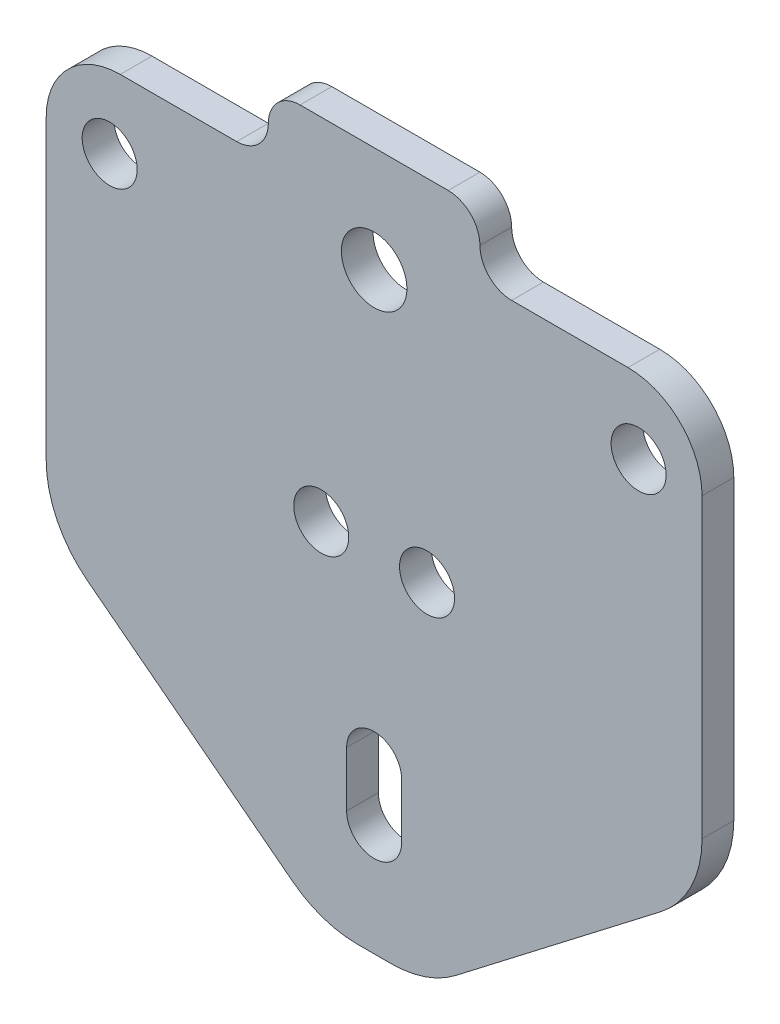
ISO-10303-21;
HEADER;
FILE_DESCRIPTION(('STEP AP214'),'2;1');
FILE_NAME('part.step','',(''),(''),'','','');
FILE_SCHEMA(('AUTOMOTIVE_DESIGN { 1 0 10303 214 1 1 1 1 }'));
ENDSEC;
DATA;
#1=APPLICATION_CONTEXT('core data for automotive mechanical design processes');
#2=APPLICATION_PROTOCOL_DEFINITION('international standard','automotive_design',2000,#1);
#3=PRODUCT_CONTEXT('',#1,'mechanical');
#4=PRODUCT('Part','Part','',(#3));
#5=PRODUCT_RELATED_PRODUCT_CATEGORY('part','',(#4));
#6=PRODUCT_DEFINITION_FORMATION('','',#4);
#7=PRODUCT_DEFINITION_CONTEXT('part definition',#1,'design');
#8=PRODUCT_DEFINITION('design','',#6,#7);
#9=PRODUCT_DEFINITION_SHAPE('','',#8);
#10=(LENGTH_UNIT() NAMED_UNIT(*) SI_UNIT(.MILLI.,.METRE.));
#11=(NAMED_UNIT(*) PLANE_ANGLE_UNIT() SI_UNIT($,.RADIAN.));
#12=(NAMED_UNIT(*) SI_UNIT($,.STERADIAN.) SOLID_ANGLE_UNIT());
#13=UNCERTAINTY_MEASURE_WITH_UNIT(LENGTH_MEASURE(1.E-05),#10,'distance_accuracy_value','');
#14=(GEOMETRIC_REPRESENTATION_CONTEXT(3) GLOBAL_UNCERTAINTY_ASSIGNED_CONTEXT((#13)) GLOBAL_UNIT_ASSIGNED_CONTEXT((#10,
#11,#12)) REPRESENTATION_CONTEXT('',''));
#15=CARTESIAN_POINT('',(0.,0.,0.));
#16=DIRECTION('',(0.,0.,1.));
#17=DIRECTION('',(1.,0.,0.));
#18=AXIS2_PLACEMENT_3D('',#15,#16,#17);
#19=CARTESIAN_POINT('',(10.,0.142069413619485,-3.));
#20=DIRECTION('',(0.,1.,0.));
#21=DIRECTION('',(-1.,0.,0.));
#22=AXIS2_PLACEMENT_3D('',#19,#20,#21);
#23=PLANE('',#22);
#24=DIRECTION('',(-1.,0.,0.));
#25=VECTOR('',#24,1.);
#26=CARTESIAN_POINT('',(10.,0.142069413619485,-3.));
#27=LINE('',#26,#25);
#28=CARTESIAN_POINT('',(7.,0.142069413619485,-3.));
#29=VERTEX_POINT('',#28);
#30=CARTESIAN_POINT('',(-7.,0.142069413619483,-3.));
#31=VERTEX_POINT('',#30);
#32=EDGE_CURVE('E265',#29,#31,#27,.T.);
#33=ORIENTED_EDGE('',*,*,#32,.T.);
#34=DIRECTION('',(0.,0.,1.));
#35=VECTOR('',#34,1.);
#36=CARTESIAN_POINT('',(-7.,0.142069413619483,-3.));
#37=LINE('',#36,#35);
#38=CARTESIAN_POINT('',(-7.,0.142069413619483,0.));
#39=VERTEX_POINT('',#38);
#40=EDGE_CURVE('E347',#31,#39,#37,.T.);
#41=ORIENTED_EDGE('',*,*,#40,.T.);
#42=DIRECTION('',(-1.,0.,0.));
#43=VECTOR('',#42,1.);
#44=CARTESIAN_POINT('',(10.,0.142069413619485,0.));
#45=LINE('',#44,#43);
#46=CARTESIAN_POINT('',(7.,0.142069413619485,0.));
#47=VERTEX_POINT('',#46);
#48=EDGE_CURVE('E249',#47,#39,#45,.T.);
#49=ORIENTED_EDGE('',*,*,#48,.F.);
#50=DIRECTION('',(0.,0.,1.));
#51=VECTOR('',#50,1.);
#52=CARTESIAN_POINT('',(7.,0.142069413619485,-3.));
#53=LINE('',#52,#51);
#54=EDGE_CURVE('E344',#47,#29,#53,.F.);
#55=ORIENTED_EDGE('',*,*,#54,.T.);
#56=EDGE_LOOP('',(#33,#41,#49,#55));
#57=FACE_BOUND('',#56,.T.);
#58=ADVANCED_FACE('F38',(#57),#23,.T.);
#59=CARTESIAN_POINT('',(10.,-5.85793058638052,-3.));
#60=DIRECTION('',(0.,1.,0.));
#61=DIRECTION('',(-1.,0.,0.));
#62=AXIS2_PLACEMENT_3D('',#59,#60,#61);
#63=PLANE('',#62);
#64=DIRECTION('',(-1.,0.,0.));
#65=VECTOR('',#64,1.);
#66=CARTESIAN_POINT('',(10.,-5.85793058638052,-3.));
#67=LINE('',#66,#65);
#68=CARTESIAN_POINT('',(24.,-5.85793058638051,-3.));
#69=VERTEX_POINT('',#68);
#70=CARTESIAN_POINT('',(13.,-5.85793058638052,-3.));
#71=VERTEX_POINT('',#70);
#72=EDGE_CURVE('E263',#69,#71,#67,.T.);
#73=ORIENTED_EDGE('',*,*,#72,.T.);
#74=DIRECTION('',(0.,0.,1.));
#75=VECTOR('',#74,1.);
#76=CARTESIAN_POINT('',(13.,-5.85793058638052,0.));
#77=LINE('',#76,#75);
#78=CARTESIAN_POINT('',(13.,-5.85793058638052,0.));
#79=VERTEX_POINT('',#78);
#80=EDGE_CURVE('E359',#71,#79,#77,.T.);
#81=ORIENTED_EDGE('',*,*,#80,.T.);
#82=DIRECTION('',(-1.,0.,0.));
#83=VECTOR('',#82,1.);
#84=CARTESIAN_POINT('',(10.,-5.85793058638052,0.));
#85=LINE('',#84,#83);
#86=CARTESIAN_POINT('',(24.,-5.85793058638051,0.));
#87=VERTEX_POINT('',#86);
#88=EDGE_CURVE('E284',#87,#79,#85,.T.);
#89=ORIENTED_EDGE('',*,*,#88,.F.);
#90=DIRECTION('',(0.,0.,1.));
#91=VECTOR('',#90,1.);
#92=CARTESIAN_POINT('',(24.,-5.85793058638051,-3.));
#93=LINE('',#92,#91);
#94=EDGE_CURVE('E342',#87,#69,#93,.F.);
#95=ORIENTED_EDGE('',*,*,#94,.T.);
#96=EDGE_LOOP('',(#73,#81,#89,#95));
#97=FACE_BOUND('',#96,.T.);
#98=ADVANCED_FACE('F385',(#97),#63,.T.);
#99=CARTESIAN_POINT('',(31.,-5.85793058638051,-3.));
#100=DIRECTION('',(1.,0.,0.));
#101=DIRECTION('',(0.,1.,0.));
#102=AXIS2_PLACEMENT_3D('',#99,#100,#101);
#103=PLANE('',#102);
#104=DIRECTION('',(0.,1.,0.));
#105=VECTOR('',#104,1.);
#106=CARTESIAN_POINT('',(31.,-5.85793058638051,-3.));
#107=LINE('',#106,#105);
#108=CARTESIAN_POINT('',(31.,-40.9339156118753,-3.));
#109=VERTEX_POINT('',#108);
#110=CARTESIAN_POINT('',(31.,-12.8579305863805,-3.));
#111=VERTEX_POINT('',#110);
#112=EDGE_CURVE('E260',#109,#111,#107,.T.);
#113=ORIENTED_EDGE('',*,*,#112,.T.);
#114=DIRECTION('',(0.,0.,1.));
#115=VECTOR('',#114,1.);
#116=CARTESIAN_POINT('',(31.,-12.8579305863805,-3.));
#117=LINE('',#116,#115);
#118=CARTESIAN_POINT('',(31.,-12.8579305863805,0.));
#119=VERTEX_POINT('',#118);
#120=EDGE_CURVE('E339',#111,#119,#117,.T.);
#121=ORIENTED_EDGE('',*,*,#120,.T.);
#122=DIRECTION('',(0.,1.,0.));
#123=VECTOR('',#122,1.);
#124=CARTESIAN_POINT('',(31.,-5.85793058638051,0.));
#125=LINE('',#124,#123);
#126=CARTESIAN_POINT('',(31.,-40.9339156118753,0.));
#127=VERTEX_POINT('',#126);
#128=EDGE_CURVE('E281',#127,#119,#125,.T.);
#129=ORIENTED_EDGE('',*,*,#128,.F.);
#130=DIRECTION('',(0.,0.,1.));
#131=VECTOR('',#130,1.);
#132=CARTESIAN_POINT('',(31.,-40.9339156118753,-3.));
#133=LINE('',#132,#131);
#134=EDGE_CURVE('E301',#127,#109,#133,.F.);
#135=ORIENTED_EDGE('',*,*,#134,.T.);
#136=EDGE_LOOP('',(#113,#121,#129,#135));
#137=FACE_BOUND('',#136,.T.);
#138=ADVANCED_FACE('F395',(#137),#103,.T.);
#139=CARTESIAN_POINT('',(31.,-45.8579305863805,-3.));
#140=DIRECTION('',(0.609710760849692,-0.7926239891046,0.));
#141=DIRECTION('',(0.7926239891046,0.609710760849692,0.));
#142=AXIS2_PLACEMENT_3D('',#139,#140,#141);
#143=PLANE('',#142);
#144=DIRECTION('',(0.7926239891046,0.609710760849692,0.));
#145=VECTOR('',#144,1.);
#146=CARTESIAN_POINT('',(31.,-45.8579305863805,-3.));
#147=LINE('',#146,#145);
#148=CARTESIAN_POINT('',(7.6958881416402,-63.7841704774265,-3.));
#149=VERTEX_POINT('',#148);
#150=CARTESIAN_POINT('',(27.0971076084969,-48.8601555029213,-3.));
#151=VERTEX_POINT('',#150);
#152=EDGE_CURVE('E257',#149,#151,#147,.T.);
#153=ORIENTED_EDGE('',*,*,#152,.T.);
#154=DIRECTION('',(0.,0.,1.));
#155=VECTOR('',#154,1.);
#156=CARTESIAN_POINT('',(27.0971076084969,-48.8601555029213,-3.));
#157=LINE('',#156,#155);
#158=CARTESIAN_POINT('',(27.0971076084969,-48.8601555029213,0.));
#159=VERTEX_POINT('',#158);
#160=EDGE_CURVE('E290',#151,#159,#157,.T.);
#161=ORIENTED_EDGE('',*,*,#160,.T.);
#162=DIRECTION('',(0.7926239891046,0.609710760849692,0.));
#163=VECTOR('',#162,1.);
#164=CARTESIAN_POINT('',(31.,-45.8579305863805,0.));
#165=LINE('',#164,#163);
#166=CARTESIAN_POINT('',(7.6958881416402,-63.7841704774265,0.));
#167=VERTEX_POINT('',#166);
#168=EDGE_CURVE('E278',#167,#159,#165,.T.);
#169=ORIENTED_EDGE('',*,*,#168,.F.);
#170=DIRECTION('',(0.,0.,1.));
#171=VECTOR('',#170,1.);
#172=CARTESIAN_POINT('',(7.6958881416402,-63.7841704774265,-3.));
#173=LINE('',#172,#171);
#174=EDGE_CURVE('E268',#167,#149,#173,.F.);
#175=ORIENTED_EDGE('',*,*,#174,.T.);
#176=EDGE_LOOP('',(#153,#161,#169,#175));
#177=FACE_BOUND('',#176,.T.);
#178=ADVANCED_FACE('F406',(#177),#143,.T.);
#179=CARTESIAN_POINT('',(5.,-65.8579305863805,-3.));
#180=DIRECTION('',(0.,-1.,0.));
#181=DIRECTION('',(0.,0.,-1.));
#182=AXIS2_PLACEMENT_3D('',#179,#180,#181);
#183=PLANE('',#182);
#184=DIRECTION('',(1.,0.,0.));
#185=VECTOR('',#184,1.);
#186=CARTESIAN_POINT('',(5.,-65.8579305863805,0.));
#187=LINE('',#186,#185);
#188=CARTESIAN_POINT('',(-1.59878053314328,-65.8579305863805,0.));
#189=VERTEX_POINT('',#188);
#190=CARTESIAN_POINT('',(1.59878053314328,-65.8579305863805,0.));
#191=VERTEX_POINT('',#190);
#192=EDGE_CURVE('E275',#189,#191,#187,.T.);
#193=ORIENTED_EDGE('',*,*,#192,.F.);
#194=DIRECTION('',(0.,0.,1.));
#195=VECTOR('',#194,1.);
#196=CARTESIAN_POINT('',(-1.59878053314328,-65.8579305863805,-3.));
#197=LINE('',#196,#195);
#198=CARTESIAN_POINT('',(-1.59878053314328,-65.8579305863805,-3.));
#199=VERTEX_POINT('',#198);
#200=EDGE_CURVE('E323',#189,#199,#197,.F.);
#201=ORIENTED_EDGE('',*,*,#200,.T.);
#202=DIRECTION('',(1.,0.,0.));
#203=VECTOR('',#202,1.);
#204=CARTESIAN_POINT('',(5.,-65.8579305863805,-3.));
#205=LINE('',#204,#203);
#206=CARTESIAN_POINT('',(1.59878053314328,-65.8579305863805,-3.));
#207=VERTEX_POINT('',#206);
#208=EDGE_CURVE('E254',#199,#207,#205,.T.);
#209=ORIENTED_EDGE('',*,*,#208,.T.);
#210=DIRECTION('',(0.,0.,1.));
#211=VECTOR('',#210,1.);
#212=CARTESIAN_POINT('',(1.59878053314328,-65.8579305863805,-3.));
#213=LINE('',#212,#211);
#214=EDGE_CURVE('E320',#207,#191,#213,.T.);
#215=ORIENTED_EDGE('',*,*,#214,.T.);
#216=EDGE_LOOP('',(#193,#201,#209,#215));
#217=FACE_BOUND('',#216,.T.);
#218=ADVANCED_FACE('F414',(#217),#183,.T.);
#219=CARTESIAN_POINT('',(-31.,-45.8579305863805,-3.));
#220=DIRECTION('',(-0.609710760849692,-0.7926239891046,0.));
#221=DIRECTION('',(0.792623989104601,-0.609710760849692,0.));
#222=AXIS2_PLACEMENT_3D('',#219,#220,#221);
#223=PLANE('',#222);
#224=DIRECTION('',(0.792623989104601,-0.609710760849692,0.));
#225=VECTOR('',#224,1.);
#226=CARTESIAN_POINT('',(-31.,-45.8579305863805,0.));
#227=LINE('',#226,#225);
#228=CARTESIAN_POINT('',(-27.0971076084969,-48.8601555029214,0.));
#229=VERTEX_POINT('',#228);
#230=CARTESIAN_POINT('',(-7.6958881416402,-63.7841704774265,0.));
#231=VERTEX_POINT('',#230);
#232=EDGE_CURVE('E272',#229,#231,#227,.T.);
#233=ORIENTED_EDGE('',*,*,#232,.F.);
#234=DIRECTION('',(0.,0.,1.));
#235=VECTOR('',#234,1.);
#236=CARTESIAN_POINT('',(-27.0971076084969,-48.8601555029214,-3.));
#237=LINE('',#236,#235);
#238=CARTESIAN_POINT('',(-27.0971076084969,-48.8601555029214,-3.));
#239=VERTEX_POINT('',#238);
#240=EDGE_CURVE('E318',#229,#239,#237,.F.);
#241=ORIENTED_EDGE('',*,*,#240,.T.);
#242=DIRECTION('',(0.792623989104601,-0.609710760849692,0.));
#243=VECTOR('',#242,1.);
#244=CARTESIAN_POINT('',(-31.,-45.8579305863805,-3.));
#245=LINE('',#244,#243);
#246=CARTESIAN_POINT('',(-7.6958881416402,-63.7841704774265,-3.));
#247=VERTEX_POINT('',#246);
#248=EDGE_CURVE('E251',#239,#247,#245,.T.);
#249=ORIENTED_EDGE('',*,*,#248,.T.);
#250=DIRECTION('',(0.,0.,1.));
#251=VECTOR('',#250,1.);
#252=CARTESIAN_POINT('',(-7.69588814164021,-63.7841704774265,-3.));
#253=LINE('',#252,#251);
#254=EDGE_CURVE('E315',#247,#231,#253,.T.);
#255=ORIENTED_EDGE('',*,*,#254,.T.);
#256=EDGE_LOOP('',(#233,#241,#249,#255));
#257=FACE_BOUND('',#256,.T.);
#258=ADVANCED_FACE('F424',(#257),#223,.T.);
#259=CARTESIAN_POINT('',(-31.,-45.8579305863805,-3.));
#260=DIRECTION('',(-1.,0.,0.));
#261=DIRECTION('',(0.,-1.,0.));
#262=AXIS2_PLACEMENT_3D('',#259,#260,#261);
#263=PLANE('',#262);
#264=DIRECTION('',(0.,-1.,0.));
#265=VECTOR('',#264,1.);
#266=CARTESIAN_POINT('',(-31.,-45.8579305863805,0.));
#267=LINE('',#266,#265);
#268=CARTESIAN_POINT('',(-31.,-12.8579305863805,0.));
#269=VERTEX_POINT('',#268);
#270=CARTESIAN_POINT('',(-31.,-40.9339156118754,0.));
#271=VERTEX_POINT('',#270);
#272=EDGE_CURVE('E270',#269,#271,#267,.T.);
#273=ORIENTED_EDGE('',*,*,#272,.F.);
#274=DIRECTION('',(0.,0.,1.));
#275=VECTOR('',#274,1.);
#276=CARTESIAN_POINT('',(-31.,-12.8579305863805,-3.));
#277=LINE('',#276,#275);
#278=CARTESIAN_POINT('',(-31.,-12.8579305863805,-3.));
#279=VERTEX_POINT('',#278);
#280=EDGE_CURVE('E332',#269,#279,#277,.F.);
#281=ORIENTED_EDGE('',*,*,#280,.T.);
#282=DIRECTION('',(0.,-1.,0.));
#283=VECTOR('',#282,1.);
#284=CARTESIAN_POINT('',(-31.,-45.8579305863805,-3.));
#285=LINE('',#284,#283);
#286=CARTESIAN_POINT('',(-31.,-40.9339156118754,-3.));
#287=VERTEX_POINT('',#286);
#288=EDGE_CURVE('E248',#279,#287,#285,.T.);
#289=ORIENTED_EDGE('',*,*,#288,.T.);
#290=DIRECTION('',(0.,0.,1.));
#291=VECTOR('',#290,1.);
#292=CARTESIAN_POINT('',(-31.,-40.9339156118754,-3.));
#293=LINE('',#292,#291);
#294=EDGE_CURVE('E312',#287,#271,#293,.T.);
#295=ORIENTED_EDGE('',*,*,#294,.T.);
#296=EDGE_LOOP('',(#273,#281,#289,#295));
#297=FACE_BOUND('',#296,.T.);
#298=ADVANCED_FACE('F433',(#297),#263,.T.);
#299=CARTESIAN_POINT('',(-31.,-5.85793058638051,-3.));
#300=DIRECTION('',(0.,1.,0.));
#301=DIRECTION('',(-1.,0.,0.));
#302=AXIS2_PLACEMENT_3D('',#299,#300,#301);
#303=PLANE('',#302);
#304=DIRECTION('',(-1.,0.,0.));
#305=VECTOR('',#304,1.);
#306=CARTESIAN_POINT('',(-31.,-5.85793058638051,0.));
#307=LINE('',#306,#305);
#308=CARTESIAN_POINT('',(-13.,-5.85793058638052,0.));
#309=VERTEX_POINT('',#308);
#310=CARTESIAN_POINT('',(-24.,-5.85793058638051,0.));
#311=VERTEX_POINT('',#310);
#312=EDGE_CURVE('E243',#309,#311,#307,.T.);
#313=ORIENTED_EDGE('',*,*,#312,.F.);
#314=DIRECTION('',(0.,0.,1.));
#315=VECTOR('',#314,1.);
#316=CARTESIAN_POINT('',(-13.,-5.85793058638052,-3.));
#317=LINE('',#316,#315);
#318=CARTESIAN_POINT('',(-13.,-5.85793058638052,-3.));
#319=VERTEX_POINT('',#318);
#320=EDGE_CURVE('E357',#309,#319,#317,.F.);
#321=ORIENTED_EDGE('',*,*,#320,.T.);
#322=DIRECTION('',(-1.,0.,0.));
#323=VECTOR('',#322,1.);
#324=CARTESIAN_POINT('',(-31.,-5.85793058638051,-3.));
#325=LINE('',#324,#323);
#326=CARTESIAN_POINT('',(-24.,-5.85793058638051,-3.));
#327=VERTEX_POINT('',#326);
#328=EDGE_CURVE('E246',#319,#327,#325,.T.);
#329=ORIENTED_EDGE('',*,*,#328,.T.);
#330=DIRECTION('',(0.,0.,1.));
#331=VECTOR('',#330,1.);
#332=CARTESIAN_POINT('',(-24.,-5.85793058638051,-3.));
#333=LINE('',#332,#331);
#334=EDGE_CURVE('E325',#327,#311,#333,.T.);
#335=ORIENTED_EDGE('',*,*,#334,.T.);
#336=EDGE_LOOP('',(#313,#321,#329,#335));
#337=FACE_BOUND('',#336,.T.);
#338=ADVANCED_FACE('F443',(#337),#303,.T.);
#339=CARTESIAN_POINT('',(0.,0.,-3.));
#340=DIRECTION('',(0.,0.,1.));
#341=DIRECTION('',(1.,0.,0.));
#342=AXIS2_PLACEMENT_3D('',#339,#340,#341);
#343=PLANE('',#342);
#344=CARTESIAN_POINT('',(-5.,-32.9579305863805,-3.));
#345=DIRECTION('',(0.,0.,1.));
#346=DIRECTION('',(1.,0.,0.));
#347=AXIS2_PLACEMENT_3D('',#344,#345,#346);
#348=CIRCLE('',#347,2.6);
#349=CARTESIAN_POINT('',(-2.4,-32.9579305863805,-3.));
#350=VERTEX_POINT('',#349);
#351=EDGE_CURVE('E372',#350,#350,#348,.T.);
#352=ORIENTED_EDGE('',*,*,#351,.T.);
#353=EDGE_LOOP('',(#352));
#354=FACE_BOUND('',#353,.T.);
#355=CARTESIAN_POINT('',(5.,-32.9579305863805,-3.));
#356=DIRECTION('',(0.,0.,1.));
#357=DIRECTION('',(1.,0.,0.));
#358=AXIS2_PLACEMENT_3D('',#355,#356,#357);
#359=CIRCLE('',#358,2.6);
#360=CARTESIAN_POINT('',(7.6,-32.9579305863805,-3.));
#361=VERTEX_POINT('',#360);
#362=EDGE_CURVE('E743',#361,#361,#359,.T.);
#363=ORIENTED_EDGE('',*,*,#362,.T.);
#364=EDGE_LOOP('',(#363));
#365=FACE_BOUND('',#364,.T.);
#366=CARTESIAN_POINT('',(0.,-9.85793058638052,-3.));
#367=DIRECTION('',(0.,0.,1.));
#368=DIRECTION('',(1.,0.,0.));
#369=AXIS2_PLACEMENT_3D('',#366,#367,#368);
#370=CIRCLE('',#369,3.1);
#371=CARTESIAN_POINT('',(3.1,-9.85793058638052,-3.));
#372=VERTEX_POINT('',#371);
#373=EDGE_CURVE('E224',#372,#372,#370,.T.);
#374=ORIENTED_EDGE('',*,*,#373,.T.);
#375=EDGE_LOOP('',(#374));
#376=FACE_BOUND('',#375,.T.);
#377=DIRECTION('',(0.,-1.,0.));
#378=VECTOR('',#377,1.);
#379=CARTESIAN_POINT('',(-2.59999999999999,-55.4579305863805,-3.));
#380=LINE('',#379,#378);
#381=CARTESIAN_POINT('',(-2.59999999999999,-50.2579305863805,-3.));
#382=VERTEX_POINT('',#381);
#383=CARTESIAN_POINT('',(-2.59999999999999,-55.4579305863805,-3.));
#384=VERTEX_POINT('',#383);
#385=EDGE_CURVE('E198',#382,#384,#380,.T.);
#386=ORIENTED_EDGE('',*,*,#385,.T.);
#387=CARTESIAN_POINT('',(0.,-55.4579305863805,-3.));
#388=DIRECTION('',(0.,0.,1.));
#389=DIRECTION('',(1.,0.,0.));
#390=AXIS2_PLACEMENT_3D('',#387,#388,#389);
#391=CIRCLE('',#390,2.59999999999999);
#392=CARTESIAN_POINT('',(2.59999999999999,-55.4579305863805,-3.));
#393=VERTEX_POINT('',#392);
#394=EDGE_CURVE('E190',#384,#393,#391,.T.);
#395=ORIENTED_EDGE('',*,*,#394,.T.);
#396=DIRECTION('',(0.,1.,0.));
#397=VECTOR('',#396,1.);
#398=CARTESIAN_POINT('',(2.59999999999999,-55.4579305863805,-3.));
#399=LINE('',#398,#397);
#400=CARTESIAN_POINT('',(2.59999999999999,-50.2579305863805,-3.));
#401=VERTEX_POINT('',#400);
#402=EDGE_CURVE('E202',#393,#401,#399,.T.);
#403=ORIENTED_EDGE('',*,*,#402,.T.);
#404=CARTESIAN_POINT('',(0.,-50.2579305863805,-3.));
#405=DIRECTION('',(0.,0.,1.));
#406=DIRECTION('',(1.,0.,0.));
#407=AXIS2_PLACEMENT_3D('',#404,#405,#406);
#408=CIRCLE('',#407,2.59999999999999);
#409=EDGE_CURVE('E206',#401,#382,#408,.T.);
#410=ORIENTED_EDGE('',*,*,#409,.T.);
#411=EDGE_LOOP('',(#386,#395,#403,#410));
#412=FACE_BOUND('',#411,.T.);
#413=CARTESIAN_POINT('',(25.,-12.8579305863805,-3.));
#414=DIRECTION('',(0.,0.,1.));
#415=DIRECTION('',(1.,0.,0.));
#416=AXIS2_PLACEMENT_3D('',#413,#414,#415);
#417=CIRCLE('',#416,2.6);
#418=CARTESIAN_POINT('',(27.6,-12.8579305863805,-3.));
#419=VERTEX_POINT('',#418);
#420=EDGE_CURVE('E234',#419,#419,#417,.T.);
#421=ORIENTED_EDGE('',*,*,#420,.T.);
#422=EDGE_LOOP('',(#421));
#423=FACE_BOUND('',#422,.T.);
#424=CARTESIAN_POINT('',(-25.,-12.8579305863805,-3.));
#425=DIRECTION('',(0.,0.,1.));
#426=DIRECTION('',(1.,0.,0.));
#427=AXIS2_PLACEMENT_3D('',#424,#425,#426);
#428=CIRCLE('',#427,2.6);
#429=CARTESIAN_POINT('',(-22.4,-12.8579305863805,-3.));
#430=VERTEX_POINT('',#429);
#431=EDGE_CURVE('E240',#430,#430,#428,.T.);
#432=ORIENTED_EDGE('',*,*,#431,.T.);
#433=EDGE_LOOP('',(#432));
#434=FACE_BOUND('',#433,.T.);
#435=ORIENTED_EDGE('',*,*,#328,.F.);
#436=CARTESIAN_POINT('',(-13.,-2.85793058638052,-3.));
#437=DIRECTION('',(0.,0.,1.));
#438=DIRECTION('',(1.,0.,0.));
#439=AXIS2_PLACEMENT_3D('',#436,#437,#438);
#440=CIRCLE('',#439,3.);
#441=CARTESIAN_POINT('',(-10.,-2.85793058638052,-3.));
#442=VERTEX_POINT('',#441);
#443=EDGE_CURVE('E363',#319,#442,#440,.T.);
#444=ORIENTED_EDGE('',*,*,#443,.T.);
#445=CARTESIAN_POINT('',(-7.,-2.85793058638052,-3.));
#446=DIRECTION('',(0.,0.,1.));
#447=DIRECTION('',(1.,0.,0.));
#448=AXIS2_PLACEMENT_3D('',#445,#446,#447);
#449=CIRCLE('',#448,3.);
#450=EDGE_CURVE('E355',#442,#31,#449,.F.);
#451=ORIENTED_EDGE('',*,*,#450,.T.);
#452=ORIENTED_EDGE('',*,*,#32,.F.);
#453=CARTESIAN_POINT('',(7.,-2.85793058638052,-3.));
#454=DIRECTION('',(0.,0.,1.));
#455=DIRECTION('',(1.,0.,0.));
#456=AXIS2_PLACEMENT_3D('',#453,#454,#455);
#457=CIRCLE('',#456,3.);
#458=CARTESIAN_POINT('',(10.,-2.85793058638052,-3.));
#459=VERTEX_POINT('',#458);
#460=EDGE_CURVE('E58',#29,#459,#457,.F.);
#461=ORIENTED_EDGE('',*,*,#460,.T.);
#462=CARTESIAN_POINT('',(13.,-2.85793058638052,-3.));
#463=DIRECTION('',(0.,0.,1.));
#464=DIRECTION('',(1.,0.,0.));
#465=AXIS2_PLACEMENT_3D('',#462,#463,#464);
#466=CIRCLE('',#465,3.);
#467=EDGE_CURVE('E11',#459,#71,#466,.T.);
#468=ORIENTED_EDGE('',*,*,#467,.T.);
#469=ORIENTED_EDGE('',*,*,#72,.F.);
#470=CARTESIAN_POINT('',(24.,-12.8579305863805,-3.));
#471=DIRECTION('',(0.,0.,1.));
#472=DIRECTION('',(1.,0.,0.));
#473=AXIS2_PLACEMENT_3D('',#470,#471,#472);
#474=CIRCLE('',#473,7.);
#475=EDGE_CURVE('E334',#69,#111,#474,.F.);
#476=ORIENTED_EDGE('',*,*,#475,.T.);
#477=ORIENTED_EDGE('',*,*,#112,.F.);
#478=CARTESIAN_POINT('',(21.,-40.9339156118753,-3.));
#479=DIRECTION('',(0.,0.,1.));
#480=DIRECTION('',(1.,0.,0.));
#481=AXIS2_PLACEMENT_3D('',#478,#479,#480);
#482=CIRCLE('',#481,10.);
#483=EDGE_CURVE('E310',#109,#151,#482,.F.);
#484=ORIENTED_EDGE('',*,*,#483,.T.);
#485=ORIENTED_EDGE('',*,*,#152,.F.);
#486=CARTESIAN_POINT('',(1.59878053314328,-55.8579305863805,-3.));
#487=DIRECTION('',(0.,0.,1.));
#488=DIRECTION('',(1.,0.,0.));
#489=AXIS2_PLACEMENT_3D('',#486,#487,#488);
#490=CIRCLE('',#489,10.);
#491=EDGE_CURVE('E303',#149,#207,#490,.F.);
#492=ORIENTED_EDGE('',*,*,#491,.T.);
#493=ORIENTED_EDGE('',*,*,#208,.F.);
#494=CARTESIAN_POINT('',(-1.59878053314328,-55.8579305863805,-3.));
#495=DIRECTION('',(0.,0.,1.));
#496=DIRECTION('',(1.,0.,0.));
#497=AXIS2_PLACEMENT_3D('',#494,#495,#496);
#498=CIRCLE('',#497,10.);
#499=EDGE_CURVE('E305',#199,#247,#498,.F.);
#500=ORIENTED_EDGE('',*,*,#499,.T.);
#501=ORIENTED_EDGE('',*,*,#248,.F.);
#502=CARTESIAN_POINT('',(-21.,-40.9339156118754,-3.));
#503=DIRECTION('',(0.,0.,1.));
#504=DIRECTION('',(1.,0.,0.));
#505=AXIS2_PLACEMENT_3D('',#502,#503,#504);
#506=CIRCLE('',#505,10.);
#507=EDGE_CURVE('E307',#239,#287,#506,.F.);
#508=ORIENTED_EDGE('',*,*,#507,.T.);
#509=ORIENTED_EDGE('',*,*,#288,.F.);
#510=CARTESIAN_POINT('',(-24.,-12.8579305863805,-3.));
#511=DIRECTION('',(0.,0.,1.));
#512=DIRECTION('',(1.,0.,0.));
#513=AXIS2_PLACEMENT_3D('',#510,#511,#512);
#514=CIRCLE('',#513,7.);
#515=EDGE_CURVE('E336',#279,#327,#514,.F.);
#516=ORIENTED_EDGE('',*,*,#515,.T.);
#517=EDGE_LOOP('',(#435,#444,#451,#452,#461,#468,#469,#476,#477,#484,#485,#492,#493,#500,#501,
#508,#509,#516));
#518=FACE_BOUND('',#517,.T.);
#519=ADVANCED_FACE('F208',(#354,#365,#376,#412,#423,#434,#518),#343,.F.);
#520=CARTESIAN_POINT('',(0.,0.,0.));
#521=DIRECTION('',(0.,0.,1.));
#522=DIRECTION('',(1.,0.,0.));
#523=AXIS2_PLACEMENT_3D('',#520,#521,#522);
#524=PLANE('',#523);
#525=CARTESIAN_POINT('',(-5.,-32.9579305863805,0.));
#526=DIRECTION('',(0.,0.,1.));
#527=DIRECTION('',(1.,0.,0.));
#528=AXIS2_PLACEMENT_3D('',#525,#526,#527);
#529=CIRCLE('',#528,2.6);
#530=CARTESIAN_POINT('',(-2.4,-32.9579305863805,0.));
#531=VERTEX_POINT('',#530);
#532=EDGE_CURVE('E367',#531,#531,#529,.T.);
#533=ORIENTED_EDGE('',*,*,#532,.F.);
#534=EDGE_LOOP('',(#533));
#535=FACE_BOUND('',#534,.T.);
#536=CARTESIAN_POINT('',(5.,-32.9579305863805,0.));
#537=DIRECTION('',(0.,0.,1.));
#538=DIRECTION('',(1.,0.,0.));
#539=AXIS2_PLACEMENT_3D('',#536,#537,#538);
#540=CIRCLE('',#539,2.6);
#541=CARTESIAN_POINT('',(7.6,-32.9579305863805,0.));
#542=VERTEX_POINT('',#541);
#543=EDGE_CURVE('E748',#542,#542,#540,.T.);
#544=ORIENTED_EDGE('',*,*,#543,.F.);
#545=EDGE_LOOP('',(#544));
#546=FACE_BOUND('',#545,.T.);
#547=CARTESIAN_POINT('',(0.,-9.85793058638052,0.));
#548=DIRECTION('',(0.,0.,1.));
#549=DIRECTION('',(1.,0.,0.));
#550=AXIS2_PLACEMENT_3D('',#547,#548,#549);
#551=CIRCLE('',#550,3.1);
#552=CARTESIAN_POINT('',(3.1,-9.85793058638052,0.));
#553=VERTEX_POINT('',#552);
#554=EDGE_CURVE('E217',#553,#553,#551,.T.);
#555=ORIENTED_EDGE('',*,*,#554,.F.);
#556=EDGE_LOOP('',(#555));
#557=FACE_BOUND('',#556,.T.);
#558=CARTESIAN_POINT('',(0.,-55.4579305863805,0.));
#559=DIRECTION('',(0.,0.,1.));
#560=DIRECTION('',(1.,0.,0.));
#561=AXIS2_PLACEMENT_3D('',#558,#559,#560);
#562=CIRCLE('',#561,2.59999999999999);
#563=CARTESIAN_POINT('',(-2.59999999999999,-55.4579305863805,0.));
#564=VERTEX_POINT('',#563);
#565=CARTESIAN_POINT('',(2.59999999999999,-55.4579305863805,0.));
#566=VERTEX_POINT('',#565);
#567=EDGE_CURVE('E193',#564,#566,#562,.T.);
#568=ORIENTED_EDGE('',*,*,#567,.F.);
#569=DIRECTION('',(0.,-1.,0.));
#570=VECTOR('',#569,1.);
#571=CARTESIAN_POINT('',(-2.59999999999999,-55.4579305863805,0.));
#572=LINE('',#571,#570);
#573=CARTESIAN_POINT('',(-2.59999999999999,-50.2579305863805,0.));
#574=VERTEX_POINT('',#573);
#575=EDGE_CURVE('E211',#574,#564,#572,.T.);
#576=ORIENTED_EDGE('',*,*,#575,.F.);
#577=CARTESIAN_POINT('',(0.,-50.2579305863805,0.));
#578=DIRECTION('',(0.,0.,1.));
#579=DIRECTION('',(1.,0.,0.));
#580=AXIS2_PLACEMENT_3D('',#577,#578,#579);
#581=CIRCLE('',#580,2.59999999999999);
#582=CARTESIAN_POINT('',(2.59999999999999,-50.2579305863805,0.));
#583=VERTEX_POINT('',#582);
#584=EDGE_CURVE('E214',#583,#574,#581,.T.);
#585=ORIENTED_EDGE('',*,*,#584,.F.);
#586=DIRECTION('',(0.,1.,0.));
#587=VECTOR('',#586,1.);
#588=CARTESIAN_POINT('',(2.59999999999999,-55.4579305863805,0.));
#589=LINE('',#588,#587);
#590=EDGE_CURVE('E223',#566,#583,#589,.T.);
#591=ORIENTED_EDGE('',*,*,#590,.F.);
#592=EDGE_LOOP('',(#568,#576,#585,#591));
#593=FACE_BOUND('',#592,.T.);
#594=CARTESIAN_POINT('',(25.,-12.8579305863805,0.));
#595=DIRECTION('',(0.,0.,1.));
#596=DIRECTION('',(1.,0.,0.));
#597=AXIS2_PLACEMENT_3D('',#594,#595,#596);
#598=CIRCLE('',#597,2.6);
#599=CARTESIAN_POINT('',(27.6,-12.8579305863805,0.));
#600=VERTEX_POINT('',#599);
#601=EDGE_CURVE('E230',#600,#600,#598,.T.);
#602=ORIENTED_EDGE('',*,*,#601,.F.);
#603=EDGE_LOOP('',(#602));
#604=FACE_BOUND('',#603,.T.);
#605=CARTESIAN_POINT('',(-25.,-12.8579305863805,0.));
#606=DIRECTION('',(0.,0.,1.));
#607=DIRECTION('',(1.,0.,0.));
#608=AXIS2_PLACEMENT_3D('',#605,#606,#607);
#609=CIRCLE('',#608,2.6);
#610=CARTESIAN_POINT('',(-22.4,-12.8579305863805,0.));
#611=VERTEX_POINT('',#610);
#612=EDGE_CURVE('E237',#611,#611,#609,.T.);
#613=ORIENTED_EDGE('',*,*,#612,.F.);
#614=EDGE_LOOP('',(#613));
#615=FACE_BOUND('',#614,.T.);
#616=ORIENTED_EDGE('',*,*,#48,.T.);
#617=CARTESIAN_POINT('',(-7.,-2.85793058638052,0.));
#618=DIRECTION('',(0.,0.,1.));
#619=DIRECTION('',(1.,0.,0.));
#620=AXIS2_PLACEMENT_3D('',#617,#618,#619);
#621=CIRCLE('',#620,3.);
#622=CARTESIAN_POINT('',(-10.,-2.85793058638052,0.));
#623=VERTEX_POINT('',#622);
#624=EDGE_CURVE('E352',#39,#623,#621,.T.);
#625=ORIENTED_EDGE('',*,*,#624,.T.);
#626=CARTESIAN_POINT('',(-13.,-2.85793058638052,0.));
#627=DIRECTION('',(0.,0.,1.));
#628=DIRECTION('',(1.,0.,0.));
#629=AXIS2_PLACEMENT_3D('',#626,#627,#628);
#630=CIRCLE('',#629,3.);
#631=EDGE_CURVE('E361',#623,#309,#630,.F.);
#632=ORIENTED_EDGE('',*,*,#631,.T.);
#633=ORIENTED_EDGE('',*,*,#312,.T.);
#634=CARTESIAN_POINT('',(-24.,-12.8579305863805,0.));
#635=DIRECTION('',(0.,0.,1.));
#636=DIRECTION('',(1.,0.,0.));
#637=AXIS2_PLACEMENT_3D('',#634,#635,#636);
#638=CIRCLE('',#637,7.);
#639=EDGE_CURVE('E330',#311,#269,#638,.T.);
#640=ORIENTED_EDGE('',*,*,#639,.T.);
#641=ORIENTED_EDGE('',*,*,#272,.T.);
#642=CARTESIAN_POINT('',(-21.,-40.9339156118754,0.));
#643=DIRECTION('',(0.,0.,1.));
#644=DIRECTION('',(1.,0.,0.));
#645=AXIS2_PLACEMENT_3D('',#642,#643,#644);
#646=CIRCLE('',#645,10.);
#647=EDGE_CURVE('E297',#271,#229,#646,.T.);
#648=ORIENTED_EDGE('',*,*,#647,.T.);
#649=ORIENTED_EDGE('',*,*,#232,.T.);
#650=CARTESIAN_POINT('',(-1.59878053314328,-55.8579305863805,0.));
#651=DIRECTION('',(0.,0.,1.));
#652=DIRECTION('',(1.,0.,0.));
#653=AXIS2_PLACEMENT_3D('',#650,#651,#652);
#654=CIRCLE('',#653,10.);
#655=EDGE_CURVE('E295',#231,#189,#654,.T.);
#656=ORIENTED_EDGE('',*,*,#655,.T.);
#657=ORIENTED_EDGE('',*,*,#192,.T.);
#658=CARTESIAN_POINT('',(1.59878053314328,-55.8579305863805,0.));
#659=DIRECTION('',(0.,0.,1.));
#660=DIRECTION('',(1.,0.,0.));
#661=AXIS2_PLACEMENT_3D('',#658,#659,#660);
#662=CIRCLE('',#661,10.);
#663=EDGE_CURVE('E293',#191,#167,#662,.T.);
#664=ORIENTED_EDGE('',*,*,#663,.T.);
#665=ORIENTED_EDGE('',*,*,#168,.T.);
#666=CARTESIAN_POINT('',(21.,-40.9339156118753,0.));
#667=DIRECTION('',(0.,0.,1.));
#668=DIRECTION('',(1.,0.,0.));
#669=AXIS2_PLACEMENT_3D('',#666,#667,#668);
#670=CIRCLE('',#669,10.);
#671=EDGE_CURVE('E299',#159,#127,#670,.T.);
#672=ORIENTED_EDGE('',*,*,#671,.T.);
#673=ORIENTED_EDGE('',*,*,#128,.T.);
#674=CARTESIAN_POINT('',(24.,-12.8579305863805,0.));
#675=DIRECTION('',(0.,0.,1.));
#676=DIRECTION('',(1.,0.,0.));
#677=AXIS2_PLACEMENT_3D('',#674,#675,#676);
#678=CIRCLE('',#677,7.);
#679=EDGE_CURVE('E328',#119,#87,#678,.T.);
#680=ORIENTED_EDGE('',*,*,#679,.T.);
#681=ORIENTED_EDGE('',*,*,#88,.T.);
#682=CARTESIAN_POINT('',(13.,-2.85793058638052,0.));
#683=DIRECTION('',(0.,0.,1.));
#684=DIRECTION('',(1.,0.,0.));
#685=AXIS2_PLACEMENT_3D('',#682,#683,#684);
#686=CIRCLE('',#685,3.);
#687=CARTESIAN_POINT('',(10.,-2.85793058638052,0.));
#688=VERTEX_POINT('',#687);
#689=EDGE_CURVE('E47',#79,#688,#686,.F.);
#690=ORIENTED_EDGE('',*,*,#689,.T.);
#691=CARTESIAN_POINT('',(7.,-2.85793058638052,0.));
#692=DIRECTION('',(0.,0.,1.));
#693=DIRECTION('',(1.,0.,0.));
#694=AXIS2_PLACEMENT_3D('',#691,#692,#693);
#695=CIRCLE('',#694,3.);
#696=EDGE_CURVE('E350',#688,#47,#695,.T.);
#697=ORIENTED_EDGE('',*,*,#696,.T.);
#698=EDGE_LOOP('',(#616,#625,#632,#633,#640,#641,#648,#649,#656,#657,#664,#665,#672,#673,#680,
#681,#690,#697));
#699=FACE_BOUND('',#698,.T.);
#700=ADVANCED_FACE('F388',(#535,#546,#557,#593,#604,#615,#699),#524,.T.);
#701=CARTESIAN_POINT('',(-25.,-12.8579305863805,-3.));
#702=DIRECTION('',(0.,0.,1.));
#703=DIRECTION('',(1.,0.,0.));
#704=AXIS2_PLACEMENT_3D('',#701,#702,#703);
#705=CYLINDRICAL_SURFACE('',#704,2.6);
#706=ORIENTED_EDGE('',*,*,#431,.F.);
#707=EDGE_LOOP('',(#706));
#708=FACE_BOUND('',#707,.T.);
#709=ORIENTED_EDGE('',*,*,#612,.T.);
#710=EDGE_LOOP('',(#709));
#711=FACE_BOUND('',#710,.T.);
#712=ADVANCED_FACE('F591',(#708,#711),#705,.F.);
#713=CARTESIAN_POINT('',(25.,-12.8579305863805,-3.));
#714=DIRECTION('',(0.,0.,1.));
#715=DIRECTION('',(1.,0.,0.));
#716=AXIS2_PLACEMENT_3D('',#713,#714,#715);
#717=CYLINDRICAL_SURFACE('',#716,2.6);
#718=ORIENTED_EDGE('',*,*,#420,.F.);
#719=EDGE_LOOP('',(#718));
#720=FACE_BOUND('',#719,.T.);
#721=ORIENTED_EDGE('',*,*,#601,.T.);
#722=EDGE_LOOP('',(#721));
#723=FACE_BOUND('',#722,.T.);
#724=ADVANCED_FACE('F584',(#720,#723),#717,.F.);
#725=CARTESIAN_POINT('',(0.,-55.4579305863805,-3.));
#726=DIRECTION('',(0.,0.,1.));
#727=DIRECTION('',(1.,0.,0.));
#728=AXIS2_PLACEMENT_3D('',#725,#726,#727);
#729=CYLINDRICAL_SURFACE('',#728,2.59999999999999);
#730=ORIENTED_EDGE('',*,*,#567,.T.);
#731=DIRECTION('',(0.,0.,1.));
#732=VECTOR('',#731,1.);
#733=CARTESIAN_POINT('',(2.59999999999999,-55.4579305863805,-3.));
#734=LINE('',#733,#732);
#735=EDGE_CURVE('E186',#393,#566,#734,.T.);
#736=ORIENTED_EDGE('',*,*,#735,.F.);
#737=ORIENTED_EDGE('',*,*,#394,.F.);
#738=DIRECTION('',(0.,0.,1.));
#739=VECTOR('',#738,1.);
#740=CARTESIAN_POINT('',(-2.59999999999999,-55.4579305863805,-3.));
#741=LINE('',#740,#739);
#742=EDGE_CURVE('E228',#384,#564,#741,.T.);
#743=ORIENTED_EDGE('',*,*,#742,.T.);
#744=EDGE_LOOP('',(#730,#736,#737,#743));
#745=FACE_BOUND('',#744,.T.);
#746=ADVANCED_FACE('F188',(#745),#729,.F.);
#747=CARTESIAN_POINT('',(-2.59999999999999,-55.4579305863805,-3.));
#748=DIRECTION('',(-1.,0.,0.));
#749=DIRECTION('',(0.,-1.,0.));
#750=AXIS2_PLACEMENT_3D('',#747,#748,#749);
#751=PLANE('',#750);
#752=ORIENTED_EDGE('',*,*,#575,.T.);
#753=ORIENTED_EDGE('',*,*,#742,.F.);
#754=ORIENTED_EDGE('',*,*,#385,.F.);
#755=DIRECTION('',(0.,0.,1.));
#756=VECTOR('',#755,1.);
#757=CARTESIAN_POINT('',(-2.59999999999999,-50.2579305863805,-3.));
#758=LINE('',#757,#756);
#759=EDGE_CURVE('E231',#382,#574,#758,.T.);
#760=ORIENTED_EDGE('',*,*,#759,.T.);
#761=EDGE_LOOP('',(#752,#753,#754,#760));
#762=FACE_BOUND('',#761,.T.);
#763=ADVANCED_FACE('F569',(#762),#751,.F.);
#764=CARTESIAN_POINT('',(0.,-50.2579305863805,-3.));
#765=DIRECTION('',(0.,0.,1.));
#766=DIRECTION('',(1.,0.,0.));
#767=AXIS2_PLACEMENT_3D('',#764,#765,#766);
#768=CYLINDRICAL_SURFACE('',#767,2.59999999999999);
#769=ORIENTED_EDGE('',*,*,#584,.T.);
#770=ORIENTED_EDGE('',*,*,#759,.F.);
#771=ORIENTED_EDGE('',*,*,#409,.F.);
#772=DIRECTION('',(0.,0.,1.));
#773=VECTOR('',#772,1.);
#774=CARTESIAN_POINT('',(2.59999999999999,-50.2579305863805,-3.));
#775=LINE('',#774,#773);
#776=EDGE_CURVE('E197',#401,#583,#775,.T.);
#777=ORIENTED_EDGE('',*,*,#776,.T.);
#778=EDGE_LOOP('',(#769,#770,#771,#777));
#779=FACE_BOUND('',#778,.T.);
#780=ADVANCED_FACE('F562',(#779),#768,.F.);
#781=CARTESIAN_POINT('',(2.59999999999999,-55.4579305863805,-3.));
#782=DIRECTION('',(1.,0.,0.));
#783=DIRECTION('',(0.,1.,0.));
#784=AXIS2_PLACEMENT_3D('',#781,#782,#783);
#785=PLANE('',#784);
#786=ORIENTED_EDGE('',*,*,#590,.T.);
#787=ORIENTED_EDGE('',*,*,#776,.F.);
#788=ORIENTED_EDGE('',*,*,#402,.F.);
#789=ORIENTED_EDGE('',*,*,#735,.T.);
#790=EDGE_LOOP('',(#786,#787,#788,#789));
#791=FACE_BOUND('',#790,.T.);
#792=ADVANCED_FACE('F203',(#791),#785,.F.);
#793=CARTESIAN_POINT('',(0.,-9.85793058638052,-3.));
#794=DIRECTION('',(0.,0.,1.));
#795=DIRECTION('',(1.,0.,0.));
#796=AXIS2_PLACEMENT_3D('',#793,#794,#795);
#797=CYLINDRICAL_SURFACE('',#796,3.1);
#798=ORIENTED_EDGE('',*,*,#373,.F.);
#799=EDGE_LOOP('',(#798));
#800=FACE_BOUND('',#799,.T.);
#801=ORIENTED_EDGE('',*,*,#554,.T.);
#802=EDGE_LOOP('',(#801));
#803=FACE_BOUND('',#802,.T.);
#804=ADVANCED_FACE('F547',(#800,#803),#797,.F.);
#805=CARTESIAN_POINT('',(5.,-32.9579305863805,-3.));
#806=DIRECTION('',(0.,0.,1.));
#807=DIRECTION('',(1.,0.,0.));
#808=AXIS2_PLACEMENT_3D('',#805,#806,#807);
#809=CYLINDRICAL_SURFACE('',#808,2.6);
#810=ORIENTED_EDGE('',*,*,#362,.F.);
#811=EDGE_LOOP('',(#810));
#812=FACE_BOUND('',#811,.T.);
#813=ORIENTED_EDGE('',*,*,#543,.T.);
#814=EDGE_LOOP('',(#813));
#815=FACE_BOUND('',#814,.T.);
#816=ADVANCED_FACE('F538',(#812,#815),#809,.F.);
#817=CARTESIAN_POINT('',(-5.,-32.9579305863805,-3.));
#818=DIRECTION('',(0.,0.,1.));
#819=DIRECTION('',(1.,0.,0.));
#820=AXIS2_PLACEMENT_3D('',#817,#818,#819);
#821=CYLINDRICAL_SURFACE('',#820,2.6);
#822=ORIENTED_EDGE('',*,*,#351,.F.);
#823=EDGE_LOOP('',(#822));
#824=FACE_BOUND('',#823,.T.);
#825=ORIENTED_EDGE('',*,*,#532,.T.);
#826=EDGE_LOOP('',(#825));
#827=FACE_BOUND('',#826,.T.);
#828=ADVANCED_FACE('F476',(#824,#827),#821,.F.);
#829=CARTESIAN_POINT('',(21.,-40.9339156118753,-3.));
#830=DIRECTION('',(0.,0.,1.));
#831=DIRECTION('',(1.,0.,0.));
#832=AXIS2_PLACEMENT_3D('',#829,#830,#831);
#833=CYLINDRICAL_SURFACE('',#832,10.);
#834=ORIENTED_EDGE('',*,*,#483,.F.);
#835=ORIENTED_EDGE('',*,*,#134,.F.);
#836=ORIENTED_EDGE('',*,*,#671,.F.);
#837=ORIENTED_EDGE('',*,*,#160,.F.);
#838=EDGE_LOOP('',(#834,#835,#836,#837));
#839=FACE_BOUND('',#838,.T.);
#840=ADVANCED_FACE('F403',(#839),#833,.T.);
#841=CARTESIAN_POINT('',(-21.,-40.9339156118754,-3.));
#842=DIRECTION('',(0.,0.,1.));
#843=DIRECTION('',(1.,0.,0.));
#844=AXIS2_PLACEMENT_3D('',#841,#842,#843);
#845=CYLINDRICAL_SURFACE('',#844,10.);
#846=ORIENTED_EDGE('',*,*,#507,.F.);
#847=ORIENTED_EDGE('',*,*,#240,.F.);
#848=ORIENTED_EDGE('',*,*,#647,.F.);
#849=ORIENTED_EDGE('',*,*,#294,.F.);
#850=EDGE_LOOP('',(#846,#847,#848,#849));
#851=FACE_BOUND('',#850,.T.);
#852=ADVANCED_FACE('F431',(#851),#845,.T.);
#853=CARTESIAN_POINT('',(-1.59878053314328,-55.8579305863805,-3.));
#854=DIRECTION('',(0.,0.,1.));
#855=DIRECTION('',(1.,0.,0.));
#856=AXIS2_PLACEMENT_3D('',#853,#854,#855);
#857=CYLINDRICAL_SURFACE('',#856,10.);
#858=ORIENTED_EDGE('',*,*,#499,.F.);
#859=ORIENTED_EDGE('',*,*,#200,.F.);
#860=ORIENTED_EDGE('',*,*,#655,.F.);
#861=ORIENTED_EDGE('',*,*,#254,.F.);
#862=EDGE_LOOP('',(#858,#859,#860,#861));
#863=FACE_BOUND('',#862,.T.);
#864=ADVANCED_FACE('F421',(#863),#857,.T.);
#865=CARTESIAN_POINT('',(1.59878053314328,-55.8579305863805,-3.));
#866=DIRECTION('',(0.,0.,1.));
#867=DIRECTION('',(1.,0.,0.));
#868=AXIS2_PLACEMENT_3D('',#865,#866,#867);
#869=CYLINDRICAL_SURFACE('',#868,10.);
#870=ORIENTED_EDGE('',*,*,#491,.F.);
#871=ORIENTED_EDGE('',*,*,#174,.F.);
#872=ORIENTED_EDGE('',*,*,#663,.F.);
#873=ORIENTED_EDGE('',*,*,#214,.F.);
#874=EDGE_LOOP('',(#870,#871,#872,#873));
#875=FACE_BOUND('',#874,.T.);
#876=ADVANCED_FACE('F412',(#875),#869,.T.);
#877=CARTESIAN_POINT('',(-24.,-12.8579305863805,-3.));
#878=DIRECTION('',(0.,0.,1.));
#879=DIRECTION('',(1.,0.,0.));
#880=AXIS2_PLACEMENT_3D('',#877,#878,#879);
#881=CYLINDRICAL_SURFACE('',#880,7.);
#882=ORIENTED_EDGE('',*,*,#515,.F.);
#883=ORIENTED_EDGE('',*,*,#280,.F.);
#884=ORIENTED_EDGE('',*,*,#639,.F.);
#885=ORIENTED_EDGE('',*,*,#334,.F.);
#886=EDGE_LOOP('',(#882,#883,#884,#885));
#887=FACE_BOUND('',#886,.T.);
#888=ADVANCED_FACE('F439',(#887),#881,.T.);
#889=CARTESIAN_POINT('',(24.,-12.8579305863805,-3.));
#890=DIRECTION('',(0.,0.,1.));
#891=DIRECTION('',(1.,0.,0.));
#892=AXIS2_PLACEMENT_3D('',#889,#890,#891);
#893=CYLINDRICAL_SURFACE('',#892,7.);
#894=ORIENTED_EDGE('',*,*,#475,.F.);
#895=ORIENTED_EDGE('',*,*,#94,.F.);
#896=ORIENTED_EDGE('',*,*,#679,.F.);
#897=ORIENTED_EDGE('',*,*,#120,.F.);
#898=EDGE_LOOP('',(#894,#895,#896,#897));
#899=FACE_BOUND('',#898,.T.);
#900=ADVANCED_FACE('F393',(#899),#893,.T.);
#901=CARTESIAN_POINT('',(-13.,-2.85793058638052,-3.));
#902=DIRECTION('',(0.,0.,-1.));
#903=DIRECTION('',(-1.,0.,0.));
#904=AXIS2_PLACEMENT_3D('',#901,#902,#903);
#905=CYLINDRICAL_SURFACE('',#904,3.);
#906=DIRECTION('',(0.,0.,1.));
#907=VECTOR('',#906,1.);
#908=CARTESIAN_POINT('',(-10.,-2.85793058638052,0.));
#909=LINE('',#908,#907);
#910=EDGE_CURVE('E365',#442,#623,#909,.T.);
#911=ORIENTED_EDGE('',*,*,#910,.F.);
#912=ORIENTED_EDGE('',*,*,#443,.F.);
#913=ORIENTED_EDGE('',*,*,#320,.F.);
#914=ORIENTED_EDGE('',*,*,#631,.F.);
#915=EDGE_LOOP('',(#911,#912,#913,#914));
#916=FACE_BOUND('',#915,.T.);
#917=ADVANCED_FACE('F447',(#916),#905,.F.);
#918=CARTESIAN_POINT('',(-7.,-2.85793058638052,-3.));
#919=DIRECTION('',(0.,0.,1.));
#920=DIRECTION('',(1.,0.,0.));
#921=AXIS2_PLACEMENT_3D('',#918,#919,#920);
#922=CYLINDRICAL_SURFACE('',#921,3.);
#923=ORIENTED_EDGE('',*,*,#450,.F.);
#924=ORIENTED_EDGE('',*,*,#910,.T.);
#925=ORIENTED_EDGE('',*,*,#624,.F.);
#926=ORIENTED_EDGE('',*,*,#40,.F.);
#927=EDGE_LOOP('',(#923,#924,#925,#926));
#928=FACE_BOUND('',#927,.T.);
#929=ADVANCED_FACE('F450',(#928),#922,.T.);
#930=CARTESIAN_POINT('',(13.,-2.85793058638052,-3.));
#931=DIRECTION('',(0.,0.,-1.));
#932=DIRECTION('',(-1.,0.,0.));
#933=AXIS2_PLACEMENT_3D('',#930,#931,#932);
#934=CYLINDRICAL_SURFACE('',#933,3.);
#935=ORIENTED_EDGE('',*,*,#80,.F.);
#936=ORIENTED_EDGE('',*,*,#467,.F.);
#937=DIRECTION('',(0.,0.,1.));
#938=VECTOR('',#937,1.);
#939=CARTESIAN_POINT('',(10.,-2.85793058638051,-3.));
#940=LINE('',#939,#938);
#941=EDGE_CURVE('E42',#688,#459,#940,.F.);
#942=ORIENTED_EDGE('',*,*,#941,.F.);
#943=ORIENTED_EDGE('',*,*,#689,.F.);
#944=EDGE_LOOP('',(#935,#936,#942,#943));
#945=FACE_BOUND('',#944,.T.);
#946=ADVANCED_FACE('F40',(#945),#934,.F.);
#947=CARTESIAN_POINT('',(7.,-2.85793058638052,-3.));
#948=DIRECTION('',(0.,0.,1.));
#949=DIRECTION('',(1.,0.,0.));
#950=AXIS2_PLACEMENT_3D('',#947,#948,#949);
#951=CYLINDRICAL_SURFACE('',#950,3.);
#952=ORIENTED_EDGE('',*,*,#460,.F.);
#953=ORIENTED_EDGE('',*,*,#54,.F.);
#954=ORIENTED_EDGE('',*,*,#696,.F.);
#955=ORIENTED_EDGE('',*,*,#941,.T.);
#956=EDGE_LOOP('',(#952,#953,#954,#955));
#957=FACE_BOUND('',#956,.T.);
#958=ADVANCED_FACE('F378',(#957),#951,.T.);
#959=CLOSED_SHELL('',(#58,#98,#138,#178,#218,#258,#298,#338,#519,#700,#712,#724,#746,#763,#780,
#792,#804,#816,#828,#840,#852,#864,#876,#888,#900,#917,#929,#946,#958));
#960=MANIFOLD_SOLID_BREP('B2',#959);
#961=ADVANCED_BREP_SHAPE_REPRESENTATION('',(#18,#960),#14);
#962=SHAPE_DEFINITION_REPRESENTATION(#9,#961);
ENDSEC;
END-ISO-10303-21;
